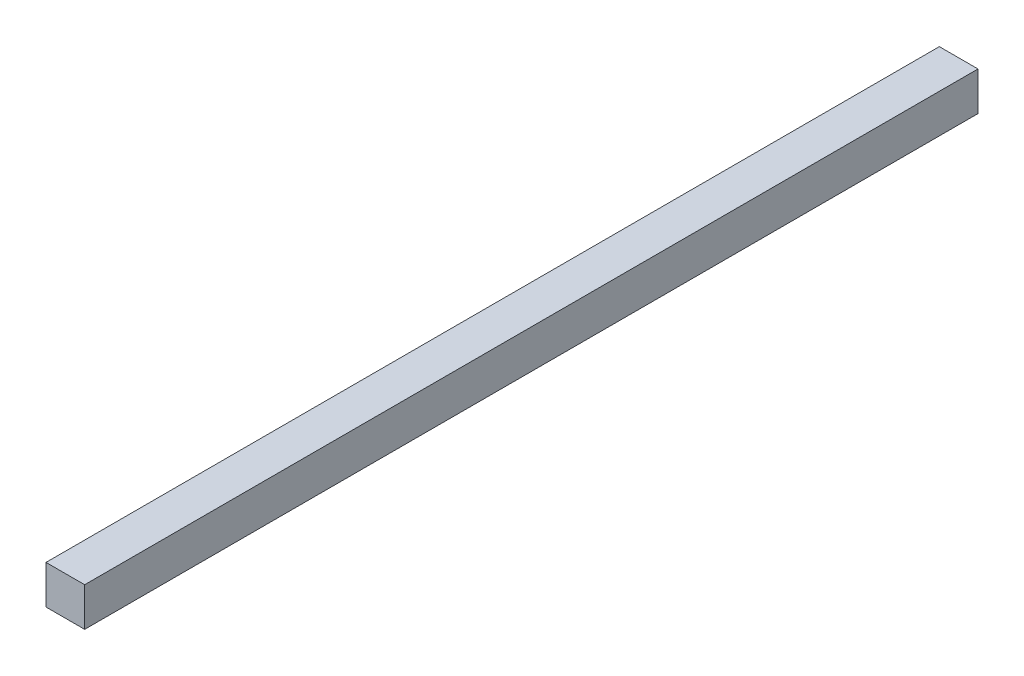
ISO-10303-21;
HEADER;
FILE_DESCRIPTION(('STEP AP214'),'2;1');
FILE_NAME('part.step','',(''),(''),'','','');
FILE_SCHEMA(('AUTOMOTIVE_DESIGN { 1 0 10303 214 1 1 1 1 }'));
ENDSEC;
DATA;
#1=APPLICATION_CONTEXT('core data for automotive mechanical design processes');
#2=APPLICATION_PROTOCOL_DEFINITION('international standard','automotive_design',2000,#1);
#3=PRODUCT_CONTEXT('',#1,'mechanical');
#4=PRODUCT('Part','Part','',(#3));
#5=PRODUCT_RELATED_PRODUCT_CATEGORY('part','',(#4));
#6=PRODUCT_DEFINITION_FORMATION('','',#4);
#7=PRODUCT_DEFINITION_CONTEXT('part definition',#1,'design');
#8=PRODUCT_DEFINITION('design','',#6,#7);
#9=PRODUCT_DEFINITION_SHAPE('','',#8);
#10=(LENGTH_UNIT() NAMED_UNIT(*) SI_UNIT(.MILLI.,.METRE.));
#11=(NAMED_UNIT(*) PLANE_ANGLE_UNIT() SI_UNIT($,.RADIAN.));
#12=(NAMED_UNIT(*) SI_UNIT($,.STERADIAN.) SOLID_ANGLE_UNIT());
#13=UNCERTAINTY_MEASURE_WITH_UNIT(LENGTH_MEASURE(1.E-05),#10,'distance_accuracy_value','');
#14=(GEOMETRIC_REPRESENTATION_CONTEXT(3) GLOBAL_UNCERTAINTY_ASSIGNED_CONTEXT((#13)) GLOBAL_UNIT_ASSIGNED_CONTEXT((#10,
#11,#12)) REPRESENTATION_CONTEXT('',''));
#15=CARTESIAN_POINT('',(0.,0.,0.));
#16=DIRECTION('',(0.,0.,1.));
#17=DIRECTION('',(1.,0.,0.));
#18=AXIS2_PLACEMENT_3D('',#15,#16,#17);
#19=CARTESIAN_POINT('',(0.,0.,231.));
#20=DIRECTION('',(1.,0.,0.));
#21=DIRECTION('',(0.,0.,-1.));
#22=AXIS2_PLACEMENT_3D('',#19,#20,#21);
#23=PLANE('',#22);
#24=DIRECTION('',(0.,-1.,0.));
#25=VECTOR('',#24,1.);
#26=CARTESIAN_POINT('',(0.,0.,0.));
#27=LINE('',#26,#25);
#28=CARTESIAN_POINT('',(0.,10.,0.));
#29=VERTEX_POINT('',#28);
#30=CARTESIAN_POINT('',(0.,0.,0.));
#31=VERTEX_POINT('',#30);
#32=EDGE_CURVE('E96',#29,#31,#27,.T.);
#33=ORIENTED_EDGE('',*,*,#32,.T.);
#34=DIRECTION('',(0.,0.,-1.));
#35=VECTOR('',#34,1.);
#36=CARTESIAN_POINT('',(0.,0.,231.));
#37=LINE('',#36,#35);
#38=CARTESIAN_POINT('',(0.,0.,231.));
#39=VERTEX_POINT('',#38);
#40=EDGE_CURVE('E11',#39,#31,#37,.T.);
#41=ORIENTED_EDGE('',*,*,#40,.F.);
#42=DIRECTION('',(0.,-1.,0.));
#43=VECTOR('',#42,1.);
#44=CARTESIAN_POINT('',(0.,0.,231.));
#45=LINE('',#44,#43);
#46=CARTESIAN_POINT('',(0.,10.,231.));
#47=VERTEX_POINT('',#46);
#48=EDGE_CURVE('E84',#47,#39,#45,.T.);
#49=ORIENTED_EDGE('',*,*,#48,.F.);
#50=DIRECTION('',(0.,0.,-1.));
#51=VECTOR('',#50,1.);
#52=CARTESIAN_POINT('',(0.,10.,231.));
#53=LINE('',#52,#51);
#54=EDGE_CURVE('E92',#47,#29,#53,.T.);
#55=ORIENTED_EDGE('',*,*,#54,.T.);
#56=EDGE_LOOP('',(#33,#41,#49,#55));
#57=FACE_BOUND('',#56,.T.);
#58=ADVANCED_FACE('F33',(#57),#23,.F.);
#59=CARTESIAN_POINT('',(0.,0.,231.));
#60=DIRECTION('',(0.,1.,0.));
#61=DIRECTION('',(0.,0.,1.));
#62=AXIS2_PLACEMENT_3D('',#59,#60,#61);
#63=PLANE('',#62);
#64=DIRECTION('',(1.,0.,0.));
#65=VECTOR('',#64,1.);
#66=CARTESIAN_POINT('',(0.,0.,0.));
#67=LINE('',#66,#65);
#68=CARTESIAN_POINT('',(10.,0.,0.));
#69=VERTEX_POINT('',#68);
#70=EDGE_CURVE('E88',#31,#69,#67,.T.);
#71=ORIENTED_EDGE('',*,*,#70,.T.);
#72=DIRECTION('',(0.,0.,-1.));
#73=VECTOR('',#72,1.);
#74=CARTESIAN_POINT('',(10.,0.,231.));
#75=LINE('',#74,#73);
#76=CARTESIAN_POINT('',(10.,0.,231.));
#77=VERTEX_POINT('',#76);
#78=EDGE_CURVE('E41',#77,#69,#75,.T.);
#79=ORIENTED_EDGE('',*,*,#78,.F.);
#80=DIRECTION('',(1.,0.,0.));
#81=VECTOR('',#80,1.);
#82=CARTESIAN_POINT('',(0.,0.,231.));
#83=LINE('',#82,#81);
#84=EDGE_CURVE('E79',#39,#77,#83,.T.);
#85=ORIENTED_EDGE('',*,*,#84,.F.);
#86=ORIENTED_EDGE('',*,*,#40,.T.);
#87=EDGE_LOOP('',(#71,#79,#85,#86));
#88=FACE_BOUND('',#87,.T.);
#89=ADVANCED_FACE('F87',(#88),#63,.F.);
#90=CARTESIAN_POINT('',(10.,0.,231.));
#91=DIRECTION('',(-1.,0.,0.));
#92=DIRECTION('',(0.,0.,1.));
#93=AXIS2_PLACEMENT_3D('',#90,#91,#92);
#94=PLANE('',#93);
#95=DIRECTION('',(0.,1.,0.));
#96=VECTOR('',#95,1.);
#97=CARTESIAN_POINT('',(10.,0.,0.));
#98=LINE('',#97,#96);
#99=CARTESIAN_POINT('',(10.,10.,0.));
#100=VERTEX_POINT('',#99);
#101=EDGE_CURVE('E66',#69,#100,#98,.T.);
#102=ORIENTED_EDGE('',*,*,#101,.T.);
#103=DIRECTION('',(0.,0.,-1.));
#104=VECTOR('',#103,1.);
#105=CARTESIAN_POINT('',(10.,10.,231.));
#106=LINE('',#105,#104);
#107=CARTESIAN_POINT('',(10.,10.,231.));
#108=VERTEX_POINT('',#107);
#109=EDGE_CURVE('E89',#108,#100,#106,.T.);
#110=ORIENTED_EDGE('',*,*,#109,.F.);
#111=DIRECTION('',(0.,1.,0.));
#112=VECTOR('',#111,1.);
#113=CARTESIAN_POINT('',(10.,0.,231.));
#114=LINE('',#113,#112);
#115=EDGE_CURVE('E82',#77,#108,#114,.T.);
#116=ORIENTED_EDGE('',*,*,#115,.F.);
#117=ORIENTED_EDGE('',*,*,#78,.T.);
#118=EDGE_LOOP('',(#102,#110,#116,#117));
#119=FACE_BOUND('',#118,.T.);
#120=ADVANCED_FACE('F90',(#119),#94,.F.);
#121=CARTESIAN_POINT('',(0.,10.,231.));
#122=DIRECTION('',(0.,-1.,0.));
#123=DIRECTION('',(0.,0.,-1.));
#124=AXIS2_PLACEMENT_3D('',#121,#122,#123);
#125=PLANE('',#124);
#126=DIRECTION('',(-1.,0.,0.));
#127=VECTOR('',#126,1.);
#128=CARTESIAN_POINT('',(0.,10.,0.));
#129=LINE('',#128,#127);
#130=EDGE_CURVE('E72',#100,#29,#129,.T.);
#131=ORIENTED_EDGE('',*,*,#130,.T.);
#132=ORIENTED_EDGE('',*,*,#54,.F.);
#133=DIRECTION('',(-1.,0.,0.));
#134=VECTOR('',#133,1.);
#135=CARTESIAN_POINT('',(0.,10.,231.));
#136=LINE('',#135,#134);
#137=EDGE_CURVE('E49',#108,#47,#136,.T.);
#138=ORIENTED_EDGE('',*,*,#137,.F.);
#139=ORIENTED_EDGE('',*,*,#109,.T.);
#140=EDGE_LOOP('',(#131,#132,#138,#139));
#141=FACE_BOUND('',#140,.T.);
#142=ADVANCED_FACE('F103',(#141),#125,.F.);
#143=CARTESIAN_POINT('',(0.,0.,231.));
#144=DIRECTION('',(0.,0.,-1.));
#145=DIRECTION('',(-1.,0.,0.));
#146=AXIS2_PLACEMENT_3D('',#143,#144,#145);
#147=PLANE('',#146);
#148=ORIENTED_EDGE('',*,*,#48,.T.);
#149=ORIENTED_EDGE('',*,*,#84,.T.);
#150=ORIENTED_EDGE('',*,*,#115,.T.);
#151=ORIENTED_EDGE('',*,*,#137,.T.);
#152=EDGE_LOOP('',(#148,#149,#150,#151));
#153=FACE_BOUND('',#152,.T.);
#154=ADVANCED_FACE('F80',(#153),#147,.F.);
#155=CARTESIAN_POINT('',(0.,0.,0.));
#156=DIRECTION('',(0.,0.,-1.));
#157=DIRECTION('',(-1.,0.,0.));
#158=AXIS2_PLACEMENT_3D('',#155,#156,#157);
#159=PLANE('',#158);
#160=ORIENTED_EDGE('',*,*,#32,.F.);
#161=ORIENTED_EDGE('',*,*,#130,.F.);
#162=ORIENTED_EDGE('',*,*,#101,.F.);
#163=ORIENTED_EDGE('',*,*,#70,.F.);
#164=EDGE_LOOP('',(#160,#161,#162,#163));
#165=FACE_BOUND('',#164,.T.);
#166=ADVANCED_FACE('F106',(#165),#159,.T.);
#167=CLOSED_SHELL('',(#58,#89,#120,#142,#154,#166));
#168=MANIFOLD_SOLID_BREP('B2',#167);
#169=ADVANCED_BREP_SHAPE_REPRESENTATION('',(#18,#168),#14);
#170=SHAPE_DEFINITION_REPRESENTATION(#9,#169);
ENDSEC;
END-ISO-10303-21;
